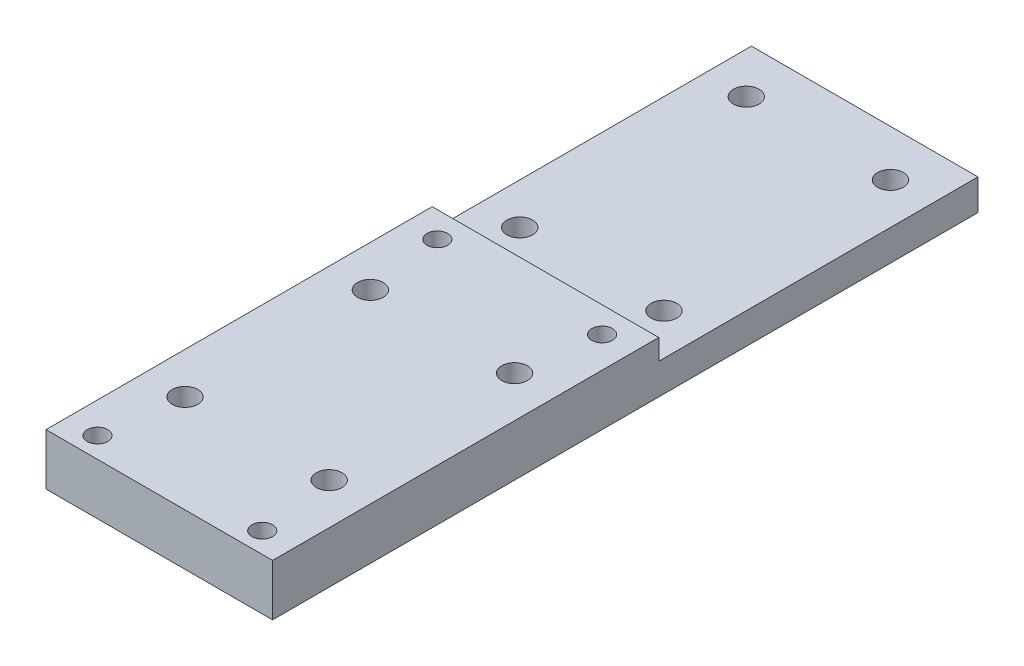
ISO-10303-21;
HEADER;
FILE_DESCRIPTION(('STEP AP214'),'2;1');
FILE_NAME('part.step','',(''),(''),'','','');
FILE_SCHEMA(('AUTOMOTIVE_DESIGN { 1 0 10303 214 1 1 1 1 }'));
ENDSEC;
DATA;
#1=APPLICATION_CONTEXT('core data for automotive mechanical design processes');
#2=APPLICATION_PROTOCOL_DEFINITION('international standard','automotive_design',2000,#1);
#3=PRODUCT_CONTEXT('',#1,'mechanical');
#4=PRODUCT('Part','Part','',(#3));
#5=PRODUCT_RELATED_PRODUCT_CATEGORY('part','',(#4));
#6=PRODUCT_DEFINITION_FORMATION('','',#4);
#7=PRODUCT_DEFINITION_CONTEXT('part definition',#1,'design');
#8=PRODUCT_DEFINITION('design','',#6,#7);
#9=PRODUCT_DEFINITION_SHAPE('','',#8);
#10=(LENGTH_UNIT() NAMED_UNIT(*) SI_UNIT(.MILLI.,.METRE.));
#11=(NAMED_UNIT(*) PLANE_ANGLE_UNIT() SI_UNIT($,.RADIAN.));
#12=(NAMED_UNIT(*) SI_UNIT($,.STERADIAN.) SOLID_ANGLE_UNIT());
#13=UNCERTAINTY_MEASURE_WITH_UNIT(LENGTH_MEASURE(1.E-05),#10,'distance_accuracy_value','');
#14=(GEOMETRIC_REPRESENTATION_CONTEXT(3) GLOBAL_UNCERTAINTY_ASSIGNED_CONTEXT((#13)) GLOBAL_UNIT_ASSIGNED_CONTEXT((#10,
#11,#12)) REPRESENTATION_CONTEXT('',''));
#15=CARTESIAN_POINT('',(0.,0.,0.));
#16=DIRECTION('',(0.,0.,1.));
#17=DIRECTION('',(1.,0.,0.));
#18=AXIS2_PLACEMENT_3D('',#15,#16,#17);
#19=CARTESIAN_POINT('',(0.,10.,0.));
#20=DIRECTION('',(0.,1.,0.));
#21=DIRECTION('',(0.,0.,1.));
#22=AXIS2_PLACEMENT_3D('',#19,#20,#21);
#23=PLANE('',#22);
#24=DIRECTION('',(1.,0.,0.));
#25=VECTOR('',#24,1.);
#26=CARTESIAN_POINT('',(-22.,10.,-6.5));
#27=LINE('',#26,#25);
#28=CARTESIAN_POINT('',(-22.,10.,-6.5));
#29=VERTEX_POINT('',#28);
#30=CARTESIAN_POINT('',(22.,10.,-6.50000000000001));
#31=VERTEX_POINT('',#30);
#32=EDGE_CURVE('E150',#29,#31,#27,.T.);
#33=ORIENTED_EDGE('',*,*,#32,.F.);
#34=DIRECTION('',(0.,0.,1.));
#35=VECTOR('',#34,1.);
#36=CARTESIAN_POINT('',(-22.,10.,-68.5));
#37=LINE('',#36,#35);
#38=CARTESIAN_POINT('',(-22.,10.,68.5));
#39=VERTEX_POINT('',#38);
#40=EDGE_CURVE('E145',#29,#39,#37,.T.);
#41=ORIENTED_EDGE('',*,*,#40,.T.);
#42=DIRECTION('',(1.,0.,0.));
#43=VECTOR('',#42,1.);
#44=CARTESIAN_POINT('',(-22.,10.,68.5));
#45=LINE('',#44,#43);
#46=CARTESIAN_POINT('',(22.,10.,68.5));
#47=VERTEX_POINT('',#46);
#48=EDGE_CURVE('E60',#39,#47,#45,.T.);
#49=ORIENTED_EDGE('',*,*,#48,.T.);
#50=DIRECTION('',(0.,0.,-1.));
#51=VECTOR('',#50,1.);
#52=CARTESIAN_POINT('',(22.,10.,-68.5));
#53=LINE('',#52,#51);
#54=EDGE_CURVE('E88',#47,#31,#53,.T.);
#55=ORIENTED_EDGE('',*,*,#54,.T.);
#56=EDGE_LOOP('',(#33,#41,#49,#55));
#57=FACE_BOUND('',#56,.T.);
#58=CARTESIAN_POINT('',(-15.9999999999993,10.,64.5));
#59=DIRECTION('',(0.,1.,0.));
#60=DIRECTION('',(0.,0.,1.));
#61=AXIS2_PLACEMENT_3D('',#58,#59,#60);
#62=CIRCLE('',#61,2.);
#63=CARTESIAN_POINT('',(-15.9999999999993,10.,66.5));
#64=VERTEX_POINT('',#63);
#65=EDGE_CURVE('E169',#64,#64,#62,.T.);
#66=ORIENTED_EDGE('',*,*,#65,.F.);
#67=EDGE_LOOP('',(#66));
#68=FACE_BOUND('',#67,.T.);
#69=CARTESIAN_POINT('',(-16.,10.,-1.5));
#70=DIRECTION('',(0.,1.,0.));
#71=DIRECTION('',(0.,0.,1.));
#72=AXIS2_PLACEMENT_3D('',#69,#70,#71);
#73=CIRCLE('',#72,2.);
#74=CARTESIAN_POINT('',(-16.,10.,0.499999999999995));
#75=VERTEX_POINT('',#74);
#76=EDGE_CURVE('E181',#75,#75,#73,.T.);
#77=ORIENTED_EDGE('',*,*,#76,.F.);
#78=EDGE_LOOP('',(#77));
#79=FACE_BOUND('',#78,.T.);
#80=CARTESIAN_POINT('',(-13.9999999999989,10.,49.5));
#81=DIRECTION('',(0.,1.,0.));
#82=DIRECTION('',(0.,0.,1.));
#83=AXIS2_PLACEMENT_3D('',#80,#81,#82);
#84=CIRCLE('',#83,2.5);
#85=CARTESIAN_POINT('',(-13.9999999999989,10.,52.));
#86=VERTEX_POINT('',#85);
#87=EDGE_CURVE('E193',#86,#86,#84,.T.);
#88=ORIENTED_EDGE('',*,*,#87,.F.);
#89=EDGE_LOOP('',(#88));
#90=FACE_BOUND('',#89,.T.);
#91=CARTESIAN_POINT('',(-13.9999999999992,10.,13.5));
#92=DIRECTION('',(0.,1.,0.));
#93=DIRECTION('',(0.,0.,1.));
#94=AXIS2_PLACEMENT_3D('',#91,#92,#93);
#95=CIRCLE('',#94,2.5);
#96=CARTESIAN_POINT('',(-13.9999999999992,10.,16.));
#97=VERTEX_POINT('',#96);
#98=EDGE_CURVE('E205',#97,#97,#95,.T.);
#99=ORIENTED_EDGE('',*,*,#98,.F.);
#100=EDGE_LOOP('',(#99));
#101=FACE_BOUND('',#100,.T.);
#102=CARTESIAN_POINT('',(14.0000000000008,10.,13.5));
#103=DIRECTION('',(0.,1.,0.));
#104=DIRECTION('',(0.,0.,1.));
#105=AXIS2_PLACEMENT_3D('',#102,#103,#104);
#106=CIRCLE('',#105,2.5);
#107=CARTESIAN_POINT('',(14.0000000000008,10.,16.));
#108=VERTEX_POINT('',#107);
#109=EDGE_CURVE('E199',#108,#108,#106,.T.);
#110=ORIENTED_EDGE('',*,*,#109,.F.);
#111=EDGE_LOOP('',(#110));
#112=FACE_BOUND('',#111,.T.);
#113=CARTESIAN_POINT('',(14.0000000000011,10.,49.5));
#114=DIRECTION('',(0.,1.,0.));
#115=DIRECTION('',(0.,0.,1.));
#116=AXIS2_PLACEMENT_3D('',#113,#114,#115);
#117=CIRCLE('',#116,2.5);
#118=CARTESIAN_POINT('',(14.0000000000011,10.,52.));
#119=VERTEX_POINT('',#118);
#120=EDGE_CURVE('E187',#119,#119,#117,.T.);
#121=ORIENTED_EDGE('',*,*,#120,.F.);
#122=EDGE_LOOP('',(#121));
#123=FACE_BOUND('',#122,.T.);
#124=CARTESIAN_POINT('',(16.,10.,-1.5));
#125=DIRECTION('',(0.,1.,0.));
#126=DIRECTION('',(0.,0.,1.));
#127=AXIS2_PLACEMENT_3D('',#124,#125,#126);
#128=CIRCLE('',#127,2.);
#129=CARTESIAN_POINT('',(16.,10.,0.499999999999995));
#130=VERTEX_POINT('',#129);
#131=EDGE_CURVE('E175',#130,#130,#128,.T.);
#132=ORIENTED_EDGE('',*,*,#131,.F.);
#133=EDGE_LOOP('',(#132));
#134=FACE_BOUND('',#133,.T.);
#135=CARTESIAN_POINT('',(16.0000000000007,10.,64.5));
#136=DIRECTION('',(0.,1.,0.));
#137=DIRECTION('',(0.,0.,1.));
#138=AXIS2_PLACEMENT_3D('',#135,#136,#137);
#139=CIRCLE('',#138,2.);
#140=CARTESIAN_POINT('',(16.0000000000007,10.,66.5));
#141=VERTEX_POINT('',#140);
#142=EDGE_CURVE('E163',#141,#141,#139,.T.);
#143=ORIENTED_EDGE('',*,*,#142,.F.);
#144=EDGE_LOOP('',(#143));
#145=FACE_BOUND('',#144,.T.);
#146=ADVANCED_FACE('F35',(#57,#68,#79,#90,#101,#112,#123,#134,#145),#23,.T.);
#147=CARTESIAN_POINT('',(0.,0.,0.));
#148=DIRECTION('',(0.,1.,0.));
#149=DIRECTION('',(0.,0.,1.));
#150=AXIS2_PLACEMENT_3D('',#147,#148,#149);
#151=PLANE('',#150);
#152=CARTESIAN_POINT('',(-15.9999999999993,0.,64.5));
#153=DIRECTION('',(0.,1.,0.));
#154=DIRECTION('',(0.,0.,1.));
#155=AXIS2_PLACEMENT_3D('',#152,#153,#154);
#156=CIRCLE('',#155,2.);
#157=CARTESIAN_POINT('',(-15.9999999999993,0.,66.5));
#158=VERTEX_POINT('',#157);
#159=EDGE_CURVE('E166',#158,#158,#156,.T.);
#160=ORIENTED_EDGE('',*,*,#159,.T.);
#161=EDGE_LOOP('',(#160));
#162=FACE_BOUND('',#161,.T.);
#163=CARTESIAN_POINT('',(-16.,0.,-1.5));
#164=DIRECTION('',(0.,1.,0.));
#165=DIRECTION('',(0.,0.,1.));
#166=AXIS2_PLACEMENT_3D('',#163,#164,#165);
#167=CIRCLE('',#166,2.);
#168=CARTESIAN_POINT('',(-16.,0.,0.499999999999995));
#169=VERTEX_POINT('',#168);
#170=EDGE_CURVE('E178',#169,#169,#167,.T.);
#171=ORIENTED_EDGE('',*,*,#170,.T.);
#172=EDGE_LOOP('',(#171));
#173=FACE_BOUND('',#172,.T.);
#174=CARTESIAN_POINT('',(-13.9999999999989,0.,49.5));
#175=DIRECTION('',(0.,1.,0.));
#176=DIRECTION('',(0.,0.,1.));
#177=AXIS2_PLACEMENT_3D('',#174,#175,#176);
#178=CIRCLE('',#177,2.5);
#179=CARTESIAN_POINT('',(-13.9999999999989,0.,52.));
#180=VERTEX_POINT('',#179);
#181=EDGE_CURVE('E190',#180,#180,#178,.T.);
#182=ORIENTED_EDGE('',*,*,#181,.T.);
#183=EDGE_LOOP('',(#182));
#184=FACE_BOUND('',#183,.T.);
#185=CARTESIAN_POINT('',(-13.9999999999992,0.,13.5));
#186=DIRECTION('',(0.,1.,0.));
#187=DIRECTION('',(0.,0.,1.));
#188=AXIS2_PLACEMENT_3D('',#185,#186,#187);
#189=CIRCLE('',#188,2.5);
#190=CARTESIAN_POINT('',(-13.9999999999992,0.,16.));
#191=VERTEX_POINT('',#190);
#192=EDGE_CURVE('E202',#191,#191,#189,.T.);
#193=ORIENTED_EDGE('',*,*,#192,.T.);
#194=EDGE_LOOP('',(#193));
#195=FACE_BOUND('',#194,.T.);
#196=CARTESIAN_POINT('',(-13.9999999999995,0.,-15.5));
#197=DIRECTION('',(0.,1.,0.));
#198=DIRECTION('',(0.,0.,1.));
#199=AXIS2_PLACEMENT_3D('',#196,#197,#198);
#200=CIRCLE('',#199,2.5);
#201=CARTESIAN_POINT('',(-13.9999999999995,0.,-13.));
#202=VERTEX_POINT('',#201);
#203=EDGE_CURVE('E213',#202,#202,#200,.T.);
#204=ORIENTED_EDGE('',*,*,#203,.T.);
#205=EDGE_LOOP('',(#204));
#206=FACE_BOUND('',#205,.T.);
#207=CARTESIAN_POINT('',(-14.,0.,-59.5));
#208=DIRECTION('',(0.,1.,0.));
#209=DIRECTION('',(0.,0.,1.));
#210=AXIS2_PLACEMENT_3D('',#207,#208,#209);
#211=CIRCLE('',#210,2.5);
#212=CARTESIAN_POINT('',(-14.,0.,-57.));
#213=VERTEX_POINT('',#212);
#214=EDGE_CURVE('E103',#213,#213,#211,.T.);
#215=ORIENTED_EDGE('',*,*,#214,.T.);
#216=EDGE_LOOP('',(#215));
#217=FACE_BOUND('',#216,.T.);
#218=DIRECTION('',(0.,0.,-1.));
#219=VECTOR('',#218,1.);
#220=CARTESIAN_POINT('',(22.,0.,-68.5));
#221=LINE('',#220,#219);
#222=CARTESIAN_POINT('',(22.,0.,68.5));
#223=VERTEX_POINT('',#222);
#224=CARTESIAN_POINT('',(22.,0.,-68.5));
#225=VERTEX_POINT('',#224);
#226=EDGE_CURVE('E95',#223,#225,#221,.T.);
#227=ORIENTED_EDGE('',*,*,#226,.F.);
#228=DIRECTION('',(1.,0.,0.));
#229=VECTOR('',#228,1.);
#230=CARTESIAN_POINT('',(-22.,0.,68.5));
#231=LINE('',#230,#229);
#232=CARTESIAN_POINT('',(-22.,0.,68.5));
#233=VERTEX_POINT('',#232);
#234=EDGE_CURVE('E78',#233,#223,#231,.T.);
#235=ORIENTED_EDGE('',*,*,#234,.F.);
#236=DIRECTION('',(0.,0.,1.));
#237=VECTOR('',#236,1.);
#238=CARTESIAN_POINT('',(-22.,0.,-68.5));
#239=LINE('',#238,#237);
#240=CARTESIAN_POINT('',(-22.,0.,-68.5));
#241=VERTEX_POINT('',#240);
#242=EDGE_CURVE('E89',#241,#233,#239,.T.);
#243=ORIENTED_EDGE('',*,*,#242,.F.);
#244=DIRECTION('',(-1.,0.,0.));
#245=VECTOR('',#244,1.);
#246=CARTESIAN_POINT('',(-22.,0.,-68.5));
#247=LINE('',#246,#245);
#248=EDGE_CURVE('E102',#225,#241,#247,.T.);
#249=ORIENTED_EDGE('',*,*,#248,.F.);
#250=EDGE_LOOP('',(#227,#235,#243,#249));
#251=FACE_BOUND('',#250,.T.);
#252=CARTESIAN_POINT('',(14.,0.,-59.5));
#253=DIRECTION('',(0.,1.,0.));
#254=DIRECTION('',(0.,0.,1.));
#255=AXIS2_PLACEMENT_3D('',#252,#253,#254);
#256=CIRCLE('',#255,2.5);
#257=CARTESIAN_POINT('',(14.,0.,-57.));
#258=VERTEX_POINT('',#257);
#259=EDGE_CURVE('E107',#258,#258,#256,.T.);
#260=ORIENTED_EDGE('',*,*,#259,.T.);
#261=EDGE_LOOP('',(#260));
#262=FACE_BOUND('',#261,.T.);
#263=CARTESIAN_POINT('',(14.0000000000005,0.,-15.5));
#264=DIRECTION('',(0.,1.,0.));
#265=DIRECTION('',(0.,0.,1.));
#266=AXIS2_PLACEMENT_3D('',#263,#264,#265);
#267=CIRCLE('',#266,2.5);
#268=CARTESIAN_POINT('',(14.0000000000005,0.,-13.));
#269=VERTEX_POINT('',#268);
#270=EDGE_CURVE('E208',#269,#269,#267,.T.);
#271=ORIENTED_EDGE('',*,*,#270,.T.);
#272=EDGE_LOOP('',(#271));
#273=FACE_BOUND('',#272,.T.);
#274=CARTESIAN_POINT('',(14.0000000000008,0.,13.5));
#275=DIRECTION('',(0.,1.,0.));
#276=DIRECTION('',(0.,0.,1.));
#277=AXIS2_PLACEMENT_3D('',#274,#275,#276);
#278=CIRCLE('',#277,2.5);
#279=CARTESIAN_POINT('',(14.0000000000008,0.,16.));
#280=VERTEX_POINT('',#279);
#281=EDGE_CURVE('E196',#280,#280,#278,.T.);
#282=ORIENTED_EDGE('',*,*,#281,.T.);
#283=EDGE_LOOP('',(#282));
#284=FACE_BOUND('',#283,.T.);
#285=CARTESIAN_POINT('',(14.0000000000011,0.,49.5));
#286=DIRECTION('',(0.,1.,0.));
#287=DIRECTION('',(0.,0.,1.));
#288=AXIS2_PLACEMENT_3D('',#285,#286,#287);
#289=CIRCLE('',#288,2.5);
#290=CARTESIAN_POINT('',(14.0000000000011,0.,52.));
#291=VERTEX_POINT('',#290);
#292=EDGE_CURVE('E184',#291,#291,#289,.T.);
#293=ORIENTED_EDGE('',*,*,#292,.T.);
#294=EDGE_LOOP('',(#293));
#295=FACE_BOUND('',#294,.T.);
#296=CARTESIAN_POINT('',(16.,0.,-1.5));
#297=DIRECTION('',(0.,1.,0.));
#298=DIRECTION('',(0.,0.,1.));
#299=AXIS2_PLACEMENT_3D('',#296,#297,#298);
#300=CIRCLE('',#299,2.);
#301=CARTESIAN_POINT('',(16.,0.,0.499999999999995));
#302=VERTEX_POINT('',#301);
#303=EDGE_CURVE('E172',#302,#302,#300,.T.);
#304=ORIENTED_EDGE('',*,*,#303,.T.);
#305=EDGE_LOOP('',(#304));
#306=FACE_BOUND('',#305,.T.);
#307=CARTESIAN_POINT('',(16.0000000000007,0.,64.5));
#308=DIRECTION('',(0.,1.,0.));
#309=DIRECTION('',(0.,0.,1.));
#310=AXIS2_PLACEMENT_3D('',#307,#308,#309);
#311=CIRCLE('',#310,2.);
#312=CARTESIAN_POINT('',(16.0000000000007,0.,66.5));
#313=VERTEX_POINT('',#312);
#314=EDGE_CURVE('E162',#313,#313,#311,.T.);
#315=ORIENTED_EDGE('',*,*,#314,.T.);
#316=EDGE_LOOP('',(#315));
#317=FACE_BOUND('',#316,.T.);
#318=ADVANCED_FACE('F99',(#162,#173,#184,#195,#206,#217,#251,#262,#273,#284,#295,#306,#317),
#151,.F.);
#319=CARTESIAN_POINT('',(22.,10.,-68.5));
#320=DIRECTION('',(-1.,0.,0.));
#321=DIRECTION('',(0.,0.,1.));
#322=AXIS2_PLACEMENT_3D('',#319,#320,#321);
#323=PLANE('',#322);
#324=DIRECTION('',(0.,0.,-1.));
#325=VECTOR('',#324,1.);
#326=CARTESIAN_POINT('',(22.,6.,-6.50000000000001));
#327=LINE('',#326,#325);
#328=CARTESIAN_POINT('',(22.,6.,-6.50000000000001));
#329=VERTEX_POINT('',#328);
#330=CARTESIAN_POINT('',(22.,6.,-68.5));
#331=VERTEX_POINT('',#330);
#332=EDGE_CURVE('E124',#329,#331,#327,.T.);
#333=ORIENTED_EDGE('',*,*,#332,.F.);
#334=DIRECTION('',(0.,-1.,0.));
#335=VECTOR('',#334,1.);
#336=CARTESIAN_POINT('',(22.,10.,-6.50000000000001));
#337=LINE('',#336,#335);
#338=EDGE_CURVE('E141',#31,#329,#337,.T.);
#339=ORIENTED_EDGE('',*,*,#338,.F.);
#340=ORIENTED_EDGE('',*,*,#54,.F.);
#341=DIRECTION('',(0.,-1.,0.));
#342=VECTOR('',#341,1.);
#343=CARTESIAN_POINT('',(22.,10.,68.5));
#344=LINE('',#343,#342);
#345=EDGE_CURVE('E81',#47,#223,#344,.T.);
#346=ORIENTED_EDGE('',*,*,#345,.T.);
#347=ORIENTED_EDGE('',*,*,#226,.T.);
#348=DIRECTION('',(0.,-1.,0.));
#349=VECTOR('',#348,1.);
#350=CARTESIAN_POINT('',(22.,10.,-68.5));
#351=LINE('',#350,#349);
#352=EDGE_CURVE('E11',#331,#225,#351,.T.);
#353=ORIENTED_EDGE('',*,*,#352,.F.);
#354=EDGE_LOOP('',(#333,#339,#340,#346,#347,#353));
#355=FACE_BOUND('',#354,.T.);
#356=ADVANCED_FACE('F37',(#355),#323,.F.);
#357=CARTESIAN_POINT('',(-22.,10.,-68.5));
#358=DIRECTION('',(0.,0.,1.));
#359=DIRECTION('',(1.,0.,0.));
#360=AXIS2_PLACEMENT_3D('',#357,#358,#359);
#361=PLANE('',#360);
#362=DIRECTION('',(0.,-1.,0.));
#363=VECTOR('',#362,1.);
#364=CARTESIAN_POINT('',(-22.,10.,-68.5));
#365=LINE('',#364,#363);
#366=CARTESIAN_POINT('',(-22.,6.,-68.5));
#367=VERTEX_POINT('',#366);
#368=EDGE_CURVE('E44',#367,#241,#365,.T.);
#369=ORIENTED_EDGE('',*,*,#368,.F.);
#370=DIRECTION('',(1.,0.,0.));
#371=VECTOR('',#370,1.);
#372=CARTESIAN_POINT('',(-22.,6.,-68.5));
#373=LINE('',#372,#371);
#374=EDGE_CURVE('E51',#367,#331,#373,.T.);
#375=ORIENTED_EDGE('',*,*,#374,.T.);
#376=ORIENTED_EDGE('',*,*,#352,.T.);
#377=ORIENTED_EDGE('',*,*,#248,.T.);
#378=EDGE_LOOP('',(#369,#375,#376,#377));
#379=FACE_BOUND('',#378,.T.);
#380=ADVANCED_FACE('F121',(#379),#361,.F.);
#381=CARTESIAN_POINT('',(-22.,10.,-68.5));
#382=DIRECTION('',(1.,0.,0.));
#383=DIRECTION('',(0.,0.,-1.));
#384=AXIS2_PLACEMENT_3D('',#381,#382,#383);
#385=PLANE('',#384);
#386=ORIENTED_EDGE('',*,*,#40,.F.);
#387=DIRECTION('',(0.,-1.,0.));
#388=VECTOR('',#387,1.);
#389=CARTESIAN_POINT('',(-22.,10.,-6.5));
#390=LINE('',#389,#388);
#391=CARTESIAN_POINT('',(-22.,6.,-6.5));
#392=VERTEX_POINT('',#391);
#393=EDGE_CURVE('E139',#29,#392,#390,.T.);
#394=ORIENTED_EDGE('',*,*,#393,.T.);
#395=DIRECTION('',(0.,0.,-1.));
#396=VECTOR('',#395,1.);
#397=CARTESIAN_POINT('',(-22.,6.,-6.5));
#398=LINE('',#397,#396);
#399=EDGE_CURVE('E119',#392,#367,#398,.T.);
#400=ORIENTED_EDGE('',*,*,#399,.T.);
#401=ORIENTED_EDGE('',*,*,#368,.T.);
#402=ORIENTED_EDGE('',*,*,#242,.T.);
#403=DIRECTION('',(0.,-1.,0.));
#404=VECTOR('',#403,1.);
#405=CARTESIAN_POINT('',(-22.,10.,68.5));
#406=LINE('',#405,#404);
#407=EDGE_CURVE('E84',#39,#233,#406,.T.);
#408=ORIENTED_EDGE('',*,*,#407,.F.);
#409=EDGE_LOOP('',(#386,#394,#400,#401,#402,#408));
#410=FACE_BOUND('',#409,.T.);
#411=ADVANCED_FACE('F117',(#410),#385,.F.);
#412=CARTESIAN_POINT('',(-22.,10.,68.5));
#413=DIRECTION('',(0.,0.,-1.));
#414=DIRECTION('',(-1.,0.,0.));
#415=AXIS2_PLACEMENT_3D('',#412,#413,#414);
#416=PLANE('',#415);
#417=ORIENTED_EDGE('',*,*,#234,.T.);
#418=ORIENTED_EDGE('',*,*,#345,.F.);
#419=ORIENTED_EDGE('',*,*,#48,.F.);
#420=ORIENTED_EDGE('',*,*,#407,.T.);
#421=EDGE_LOOP('',(#417,#418,#419,#420));
#422=FACE_BOUND('',#421,.T.);
#423=ADVANCED_FACE('F80',(#422),#416,.F.);
#424=CARTESIAN_POINT('',(-14.,10.,-59.5));
#425=DIRECTION('',(0.,-1.,0.));
#426=DIRECTION('',(0.,0.,-1.));
#427=AXIS2_PLACEMENT_3D('',#424,#425,#426);
#428=CYLINDRICAL_SURFACE('',#427,2.5);
#429=CARTESIAN_POINT('',(-14.,6.,-59.5));
#430=DIRECTION('',(0.,-1.,0.));
#431=DIRECTION('',(0.,0.,-1.));
#432=AXIS2_PLACEMENT_3D('',#429,#430,#431);
#433=CIRCLE('',#432,2.5);
#434=CARTESIAN_POINT('',(-14.,6.,-62.));
#435=VERTEX_POINT('',#434);
#436=EDGE_CURVE('E159',#435,#435,#433,.T.);
#437=ORIENTED_EDGE('',*,*,#436,.F.);
#438=EDGE_LOOP('',(#437));
#439=FACE_BOUND('',#438,.T.);
#440=ORIENTED_EDGE('',*,*,#214,.F.);
#441=EDGE_LOOP('',(#440));
#442=FACE_BOUND('',#441,.T.);
#443=ADVANCED_FACE('F257',(#439,#442),#428,.F.);
#444=CARTESIAN_POINT('',(14.,10.,-59.5));
#445=DIRECTION('',(0.,-1.,0.));
#446=DIRECTION('',(0.,0.,-1.));
#447=AXIS2_PLACEMENT_3D('',#444,#445,#446);
#448=CYLINDRICAL_SURFACE('',#447,2.5);
#449=CARTESIAN_POINT('',(14.,6.,-59.5));
#450=DIRECTION('',(0.,-1.,0.));
#451=DIRECTION('',(0.,0.,-1.));
#452=AXIS2_PLACEMENT_3D('',#449,#450,#451);
#453=CIRCLE('',#452,2.5);
#454=CARTESIAN_POINT('',(14.,6.,-62.));
#455=VERTEX_POINT('',#454);
#456=EDGE_CURVE('E156',#455,#455,#453,.T.);
#457=ORIENTED_EDGE('',*,*,#456,.F.);
#458=EDGE_LOOP('',(#457));
#459=FACE_BOUND('',#458,.T.);
#460=ORIENTED_EDGE('',*,*,#259,.F.);
#461=EDGE_LOOP('',(#460));
#462=FACE_BOUND('',#461,.T.);
#463=ADVANCED_FACE('F273',(#459,#462),#448,.F.);
#464=CARTESIAN_POINT('',(-13.9999999999995,10.,-15.5));
#465=DIRECTION('',(0.,-1.,0.));
#466=DIRECTION('',(0.,0.,-1.));
#467=AXIS2_PLACEMENT_3D('',#464,#465,#466);
#468=CYLINDRICAL_SURFACE('',#467,2.5);
#469=CARTESIAN_POINT('',(-13.9999999999995,6.,-15.5));
#470=DIRECTION('',(0.,-1.,0.));
#471=DIRECTION('',(0.,0.,-1.));
#472=AXIS2_PLACEMENT_3D('',#469,#470,#471);
#473=CIRCLE('',#472,2.5);
#474=CARTESIAN_POINT('',(-13.9999999999995,6.,-18.));
#475=VERTEX_POINT('',#474);
#476=EDGE_CURVE('E153',#475,#475,#473,.T.);
#477=ORIENTED_EDGE('',*,*,#476,.F.);
#478=EDGE_LOOP('',(#477));
#479=FACE_BOUND('',#478,.T.);
#480=ORIENTED_EDGE('',*,*,#203,.F.);
#481=EDGE_LOOP('',(#480));
#482=FACE_BOUND('',#481,.T.);
#483=ADVANCED_FACE('F280',(#479,#482),#468,.F.);
#484=CARTESIAN_POINT('',(14.0000000000005,10.,-15.5));
#485=DIRECTION('',(0.,-1.,0.));
#486=DIRECTION('',(0.,0.,-1.));
#487=AXIS2_PLACEMENT_3D('',#484,#485,#486);
#488=CYLINDRICAL_SURFACE('',#487,2.5);
#489=CARTESIAN_POINT('',(14.0000000000005,6.,-15.5));
#490=DIRECTION('',(0.,-1.,0.));
#491=DIRECTION('',(0.,0.,-1.));
#492=AXIS2_PLACEMENT_3D('',#489,#490,#491);
#493=CIRCLE('',#492,2.5);
#494=CARTESIAN_POINT('',(14.0000000000005,6.,-18.));
#495=VERTEX_POINT('',#494);
#496=EDGE_CURVE('E39',#495,#495,#493,.T.);
#497=ORIENTED_EDGE('',*,*,#496,.F.);
#498=EDGE_LOOP('',(#497));
#499=FACE_BOUND('',#498,.T.);
#500=ORIENTED_EDGE('',*,*,#270,.F.);
#501=EDGE_LOOP('',(#500));
#502=FACE_BOUND('',#501,.T.);
#503=ADVANCED_FACE('F288',(#499,#502),#488,.F.);
#504=CARTESIAN_POINT('',(-13.9999999999992,10.,13.5));
#505=DIRECTION('',(0.,-1.,0.));
#506=DIRECTION('',(0.,0.,-1.));
#507=AXIS2_PLACEMENT_3D('',#504,#505,#506);
#508=CYLINDRICAL_SURFACE('',#507,2.5);
#509=ORIENTED_EDGE('',*,*,#98,.T.);
#510=EDGE_LOOP('',(#509));
#511=FACE_BOUND('',#510,.T.);
#512=ORIENTED_EDGE('',*,*,#192,.F.);
#513=EDGE_LOOP('',(#512));
#514=FACE_BOUND('',#513,.T.);
#515=ADVANCED_FACE('F296',(#511,#514),#508,.F.);
#516=CARTESIAN_POINT('',(14.0000000000008,10.,13.5));
#517=DIRECTION('',(0.,-1.,0.));
#518=DIRECTION('',(0.,0.,-1.));
#519=AXIS2_PLACEMENT_3D('',#516,#517,#518);
#520=CYLINDRICAL_SURFACE('',#519,2.5);
#521=ORIENTED_EDGE('',*,*,#109,.T.);
#522=EDGE_LOOP('',(#521));
#523=FACE_BOUND('',#522,.T.);
#524=ORIENTED_EDGE('',*,*,#281,.F.);
#525=EDGE_LOOP('',(#524));
#526=FACE_BOUND('',#525,.T.);
#527=ADVANCED_FACE('F339',(#523,#526),#520,.F.);
#528=CARTESIAN_POINT('',(-13.9999999999989,10.,49.5));
#529=DIRECTION('',(0.,-1.,0.));
#530=DIRECTION('',(0.,0.,-1.));
#531=AXIS2_PLACEMENT_3D('',#528,#529,#530);
#532=CYLINDRICAL_SURFACE('',#531,2.5);
#533=ORIENTED_EDGE('',*,*,#87,.T.);
#534=EDGE_LOOP('',(#533));
#535=FACE_BOUND('',#534,.T.);
#536=ORIENTED_EDGE('',*,*,#181,.F.);
#537=EDGE_LOOP('',(#536));
#538=FACE_BOUND('',#537,.T.);
#539=ADVANCED_FACE('F335',(#535,#538),#532,.F.);
#540=CARTESIAN_POINT('',(14.0000000000011,10.,49.5));
#541=DIRECTION('',(0.,-1.,0.));
#542=DIRECTION('',(0.,0.,-1.));
#543=AXIS2_PLACEMENT_3D('',#540,#541,#542);
#544=CYLINDRICAL_SURFACE('',#543,2.5);
#545=ORIENTED_EDGE('',*,*,#120,.T.);
#546=EDGE_LOOP('',(#545));
#547=FACE_BOUND('',#546,.T.);
#548=ORIENTED_EDGE('',*,*,#292,.F.);
#549=EDGE_LOOP('',(#548));
#550=FACE_BOUND('',#549,.T.);
#551=ADVANCED_FACE('F331',(#547,#550),#544,.F.);
#552=CARTESIAN_POINT('',(-16.,10.,-1.5));
#553=DIRECTION('',(0.,-1.,0.));
#554=DIRECTION('',(0.,0.,-1.));
#555=AXIS2_PLACEMENT_3D('',#552,#553,#554);
#556=CYLINDRICAL_SURFACE('',#555,2.);
#557=ORIENTED_EDGE('',*,*,#76,.T.);
#558=EDGE_LOOP('',(#557));
#559=FACE_BOUND('',#558,.T.);
#560=ORIENTED_EDGE('',*,*,#170,.F.);
#561=EDGE_LOOP('',(#560));
#562=FACE_BOUND('',#561,.T.);
#563=ADVANCED_FACE('F327',(#559,#562),#556,.F.);
#564=CARTESIAN_POINT('',(16.,10.,-1.5));
#565=DIRECTION('',(0.,-1.,0.));
#566=DIRECTION('',(0.,0.,-1.));
#567=AXIS2_PLACEMENT_3D('',#564,#565,#566);
#568=CYLINDRICAL_SURFACE('',#567,2.);
#569=ORIENTED_EDGE('',*,*,#131,.T.);
#570=EDGE_LOOP('',(#569));
#571=FACE_BOUND('',#570,.T.);
#572=ORIENTED_EDGE('',*,*,#303,.F.);
#573=EDGE_LOOP('',(#572));
#574=FACE_BOUND('',#573,.T.);
#575=ADVANCED_FACE('F323',(#571,#574),#568,.F.);
#576=CARTESIAN_POINT('',(-15.9999999999993,10.,64.5));
#577=DIRECTION('',(0.,-1.,0.));
#578=DIRECTION('',(0.,0.,-1.));
#579=AXIS2_PLACEMENT_3D('',#576,#577,#578);
#580=CYLINDRICAL_SURFACE('',#579,2.);
#581=ORIENTED_EDGE('',*,*,#65,.T.);
#582=EDGE_LOOP('',(#581));
#583=FACE_BOUND('',#582,.T.);
#584=ORIENTED_EDGE('',*,*,#159,.F.);
#585=EDGE_LOOP('',(#584));
#586=FACE_BOUND('',#585,.T.);
#587=ADVANCED_FACE('F240',(#583,#586),#580,.F.);
#588=CARTESIAN_POINT('',(16.0000000000007,10.,64.5));
#589=DIRECTION('',(0.,-1.,0.));
#590=DIRECTION('',(0.,0.,-1.));
#591=AXIS2_PLACEMENT_3D('',#588,#589,#590);
#592=CYLINDRICAL_SURFACE('',#591,2.);
#593=ORIENTED_EDGE('',*,*,#142,.T.);
#594=EDGE_LOOP('',(#593));
#595=FACE_BOUND('',#594,.T.);
#596=ORIENTED_EDGE('',*,*,#314,.F.);
#597=EDGE_LOOP('',(#596));
#598=FACE_BOUND('',#597,.T.);
#599=ADVANCED_FACE('F237',(#595,#598),#592,.F.);
#600=CARTESIAN_POINT('',(-22.,10.,-6.5));
#601=DIRECTION('',(0.,0.,1.));
#602=DIRECTION('',(1.,0.,0.));
#603=AXIS2_PLACEMENT_3D('',#600,#601,#602);
#604=PLANE('',#603);
#605=ORIENTED_EDGE('',*,*,#338,.T.);
#606=DIRECTION('',(1.,0.,0.));
#607=VECTOR('',#606,1.);
#608=CARTESIAN_POINT('',(-22.,6.,-6.5));
#609=LINE('',#608,#607);
#610=EDGE_CURVE('E137',#392,#329,#609,.T.);
#611=ORIENTED_EDGE('',*,*,#610,.F.);
#612=ORIENTED_EDGE('',*,*,#393,.F.);
#613=ORIENTED_EDGE('',*,*,#32,.T.);
#614=EDGE_LOOP('',(#605,#611,#612,#613));
#615=FACE_BOUND('',#614,.T.);
#616=ADVANCED_FACE('F138',(#615),#604,.F.);
#617=CARTESIAN_POINT('',(-22.,6.,-6.5));
#618=DIRECTION('',(0.,-1.,0.));
#619=DIRECTION('',(0.,0.,-1.));
#620=AXIS2_PLACEMENT_3D('',#617,#618,#619);
#621=PLANE('',#620);
#622=ORIENTED_EDGE('',*,*,#436,.T.);
#623=EDGE_LOOP('',(#622));
#624=FACE_BOUND('',#623,.T.);
#625=ORIENTED_EDGE('',*,*,#456,.T.);
#626=EDGE_LOOP('',(#625));
#627=FACE_BOUND('',#626,.T.);
#628=ORIENTED_EDGE('',*,*,#476,.T.);
#629=EDGE_LOOP('',(#628));
#630=FACE_BOUND('',#629,.T.);
#631=ORIENTED_EDGE('',*,*,#496,.T.);
#632=EDGE_LOOP('',(#631));
#633=FACE_BOUND('',#632,.T.);
#634=ORIENTED_EDGE('',*,*,#332,.T.);
#635=ORIENTED_EDGE('',*,*,#374,.F.);
#636=ORIENTED_EDGE('',*,*,#399,.F.);
#637=ORIENTED_EDGE('',*,*,#610,.T.);
#638=EDGE_LOOP('',(#634,#635,#636,#637));
#639=FACE_BOUND('',#638,.T.);
#640=ADVANCED_FACE('F143',(#624,#627,#630,#633,#639),#621,.F.);
#641=CLOSED_SHELL('',(#146,#318,#356,#380,#411,#423,#443,#463,#483,#503,#515,#527,#539,#551,
#563,#575,#587,#599,#616,#640));
#642=MANIFOLD_SOLID_BREP('B2',#641);
#643=ADVANCED_BREP_SHAPE_REPRESENTATION('',(#18,#642),#14);
#644=SHAPE_DEFINITION_REPRESENTATION(#9,#643);
ENDSEC;
END-ISO-10303-21;
